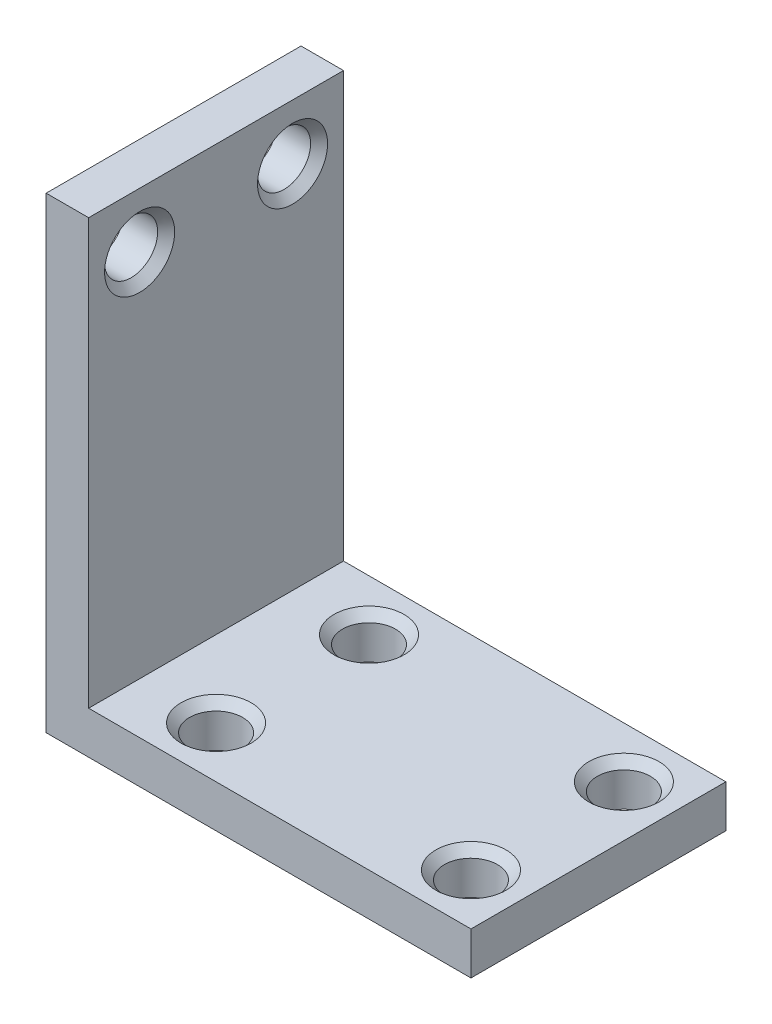
ISO-10303-21;
HEADER;
FILE_DESCRIPTION(('STEP AP214'),'2;1');
FILE_NAME('part.step','',(''),(''),'','','');
FILE_SCHEMA(('AUTOMOTIVE_DESIGN { 1 0 10303 214 1 1 1 1 }'));
ENDSEC;
DATA;
#1=APPLICATION_CONTEXT('core data for automotive mechanical design processes');
#2=APPLICATION_PROTOCOL_DEFINITION('international standard','automotive_design',2000,#1);
#3=PRODUCT_CONTEXT('',#1,'mechanical');
#4=PRODUCT('Part','Part','',(#3));
#5=PRODUCT_RELATED_PRODUCT_CATEGORY('part','',(#4));
#6=PRODUCT_DEFINITION_FORMATION('','',#4);
#7=PRODUCT_DEFINITION_CONTEXT('part definition',#1,'design');
#8=PRODUCT_DEFINITION('design','',#6,#7);
#9=PRODUCT_DEFINITION_SHAPE('','',#8);
#10=(LENGTH_UNIT() NAMED_UNIT(*) SI_UNIT(.MILLI.,.METRE.));
#11=(NAMED_UNIT(*) PLANE_ANGLE_UNIT() SI_UNIT($,.RADIAN.));
#12=(NAMED_UNIT(*) SI_UNIT($,.STERADIAN.) SOLID_ANGLE_UNIT());
#13=UNCERTAINTY_MEASURE_WITH_UNIT(LENGTH_MEASURE(1.E-05),#10,'distance_accuracy_value','');
#14=(GEOMETRIC_REPRESENTATION_CONTEXT(3) GLOBAL_UNCERTAINTY_ASSIGNED_CONTEXT((#13)) GLOBAL_UNIT_ASSIGNED_CONTEXT((#10,
#11,#12)) REPRESENTATION_CONTEXT('',''));
#15=CARTESIAN_POINT('',(0.,0.,0.));
#16=DIRECTION('',(0.,0.,1.));
#17=DIRECTION('',(1.,0.,0.));
#18=AXIS2_PLACEMENT_3D('',#15,#16,#17);
#19=CARTESIAN_POINT('',(-5.,1.,3.));
#20=DIRECTION('',(0.,0.,-1.));
#21=DIRECTION('',(-1.,0.,0.));
#22=AXIS2_PLACEMENT_3D('',#19,#20,#21);
#23=PLANE('',#22);
#24=DIRECTION('',(1.,0.,0.));
#25=VECTOR('',#24,1.);
#26=CARTESIAN_POINT('',(-5.,0.,3.));
#27=LINE('',#26,#25);
#28=CARTESIAN_POINT('',(-5.,0.,3.));
#29=VERTEX_POINT('',#28);
#30=CARTESIAN_POINT('',(5.,0.,3.));
#31=VERTEX_POINT('',#30);
#32=EDGE_CURVE('E87',#29,#31,#27,.T.);
#33=ORIENTED_EDGE('',*,*,#32,.T.);
#34=DIRECTION('',(0.,-1.,0.));
#35=VECTOR('',#34,1.);
#36=CARTESIAN_POINT('',(5.,1.,3.));
#37=LINE('',#36,#35);
#38=CARTESIAN_POINT('',(5.,1.,3.));
#39=VERTEX_POINT('',#38);
#40=EDGE_CURVE('E11',#39,#31,#37,.T.);
#41=ORIENTED_EDGE('',*,*,#40,.F.);
#42=DIRECTION('',(1.,0.,0.));
#43=VECTOR('',#42,1.);
#44=CARTESIAN_POINT('',(-5.,1.,3.));
#45=LINE('',#44,#43);
#46=CARTESIAN_POINT('',(-4.,1.,3.));
#47=VERTEX_POINT('',#46);
#48=EDGE_CURVE('E110',#47,#39,#45,.T.);
#49=ORIENTED_EDGE('',*,*,#48,.F.);
#50=DIRECTION('',(0.,-1.,0.));
#51=VECTOR('',#50,1.);
#52=CARTESIAN_POINT('',(-4.,11.,3.));
#53=LINE('',#52,#51);
#54=CARTESIAN_POINT('',(-4.,11.,3.));
#55=VERTEX_POINT('',#54);
#56=EDGE_CURVE('E105',#55,#47,#53,.T.);
#57=ORIENTED_EDGE('',*,*,#56,.F.);
#58=DIRECTION('',(1.,0.,0.));
#59=VECTOR('',#58,1.);
#60=CARTESIAN_POINT('',(-5.,11.,3.));
#61=LINE('',#60,#59);
#62=CARTESIAN_POINT('',(-5.,11.,3.));
#63=VERTEX_POINT('',#62);
#64=EDGE_CURVE('E91',#63,#55,#61,.T.);
#65=ORIENTED_EDGE('',*,*,#64,.F.);
#66=DIRECTION('',(0.,-1.,0.));
#67=VECTOR('',#66,1.);
#68=CARTESIAN_POINT('',(-5.,1.,3.));
#69=LINE('',#68,#67);
#70=EDGE_CURVE('E84',#63,#29,#69,.T.);
#71=ORIENTED_EDGE('',*,*,#70,.T.);
#72=EDGE_LOOP('',(#33,#41,#49,#57,#65,#71));
#73=FACE_BOUND('',#72,.T.);
#74=ADVANCED_FACE('F43',(#73),#23,.F.);
#75=CARTESIAN_POINT('',(5.,1.,3.));
#76=DIRECTION('',(-1.,0.,0.));
#77=DIRECTION('',(0.,0.,1.));
#78=AXIS2_PLACEMENT_3D('',#75,#76,#77);
#79=PLANE('',#78);
#80=DIRECTION('',(0.,0.,-1.));
#81=VECTOR('',#80,1.);
#82=CARTESIAN_POINT('',(5.,0.,3.));
#83=LINE('',#82,#81);
#84=CARTESIAN_POINT('',(5.,0.,-3.));
#85=VERTEX_POINT('',#84);
#86=EDGE_CURVE('E104',#31,#85,#83,.T.);
#87=ORIENTED_EDGE('',*,*,#86,.T.);
#88=DIRECTION('',(0.,-1.,0.));
#89=VECTOR('',#88,1.);
#90=CARTESIAN_POINT('',(5.,1.,-3.));
#91=LINE('',#90,#89);
#92=CARTESIAN_POINT('',(5.,1.,-3.));
#93=VERTEX_POINT('',#92);
#94=EDGE_CURVE('E50',#93,#85,#91,.T.);
#95=ORIENTED_EDGE('',*,*,#94,.F.);
#96=DIRECTION('',(0.,0.,-1.));
#97=VECTOR('',#96,1.);
#98=CARTESIAN_POINT('',(5.,1.,3.));
#99=LINE('',#98,#97);
#100=EDGE_CURVE('E113',#39,#93,#99,.T.);
#101=ORIENTED_EDGE('',*,*,#100,.F.);
#102=ORIENTED_EDGE('',*,*,#40,.T.);
#103=EDGE_LOOP('',(#87,#95,#101,#102));
#104=FACE_BOUND('',#103,.T.);
#105=ADVANCED_FACE('F122',(#104),#79,.F.);
#106=CARTESIAN_POINT('',(-5.,1.,-3.));
#107=DIRECTION('',(0.,0.,-1.));
#108=DIRECTION('',(-1.,0.,0.));
#109=AXIS2_PLACEMENT_3D('',#106,#107,#108);
#110=PLANE('',#109);
#111=DIRECTION('',(1.,0.,0.));
#112=VECTOR('',#111,1.);
#113=CARTESIAN_POINT('',(-5.,0.,-3.));
#114=LINE('',#113,#112);
#115=CARTESIAN_POINT('',(-5.,0.,-3.));
#116=VERTEX_POINT('',#115);
#117=EDGE_CURVE('E111',#116,#85,#114,.T.);
#118=ORIENTED_EDGE('',*,*,#117,.F.);
#119=DIRECTION('',(0.,-1.,0.));
#120=VECTOR('',#119,1.);
#121=CARTESIAN_POINT('',(-5.,1.,-3.));
#122=LINE('',#121,#120);
#123=CARTESIAN_POINT('',(-5.,11.,-3.));
#124=VERTEX_POINT('',#123);
#125=EDGE_CURVE('E96',#124,#116,#122,.T.);
#126=ORIENTED_EDGE('',*,*,#125,.F.);
#127=DIRECTION('',(-1.,0.,0.));
#128=VECTOR('',#127,1.);
#129=CARTESIAN_POINT('',(-5.,11.,-3.));
#130=LINE('',#129,#128);
#131=CARTESIAN_POINT('',(-4.,11.,-3.));
#132=VERTEX_POINT('',#131);
#133=EDGE_CURVE('E130',#132,#124,#130,.T.);
#134=ORIENTED_EDGE('',*,*,#133,.F.);
#135=DIRECTION('',(0.,-1.,0.));
#136=VECTOR('',#135,1.);
#137=CARTESIAN_POINT('',(-4.,11.,-3.));
#138=LINE('',#137,#136);
#139=CARTESIAN_POINT('',(-4.,1.,-3.));
#140=VERTEX_POINT('',#139);
#141=EDGE_CURVE('E128',#132,#140,#138,.T.);
#142=ORIENTED_EDGE('',*,*,#141,.T.);
#143=DIRECTION('',(1.,0.,0.));
#144=VECTOR('',#143,1.);
#145=CARTESIAN_POINT('',(-5.,1.,-3.));
#146=LINE('',#145,#144);
#147=EDGE_CURVE('E65',#140,#93,#146,.T.);
#148=ORIENTED_EDGE('',*,*,#147,.T.);
#149=ORIENTED_EDGE('',*,*,#94,.T.);
#150=EDGE_LOOP('',(#118,#126,#134,#142,#148,#149));
#151=FACE_BOUND('',#150,.T.);
#152=ADVANCED_FACE('F119',(#151),#110,.T.);
#153=CARTESIAN_POINT('',(-5.,1.,3.));
#154=DIRECTION('',(-1.,0.,0.));
#155=DIRECTION('',(0.,0.,1.));
#156=AXIS2_PLACEMENT_3D('',#153,#154,#155);
#157=PLANE('',#156);
#158=CARTESIAN_POINT('',(-5.,9.7,-1.8));
#159=DIRECTION('',(1.,0.,0.));
#160=DIRECTION('',(0.,0.,-1.));
#161=AXIS2_PLACEMENT_3D('',#158,#159,#160);
#162=CIRCLE('',#161,0.624999999999999);
#163=CARTESIAN_POINT('',(-5.,9.7,-2.425));
#164=VERTEX_POINT('',#163);
#165=EDGE_CURVE('E149',#164,#164,#162,.T.);
#166=ORIENTED_EDGE('',*,*,#165,.T.);
#167=EDGE_LOOP('',(#166));
#168=FACE_BOUND('',#167,.T.);
#169=CARTESIAN_POINT('',(-5.,9.7,1.8));
#170=DIRECTION('',(1.,0.,0.));
#171=DIRECTION('',(0.,0.,-1.));
#172=AXIS2_PLACEMENT_3D('',#169,#170,#171);
#173=CIRCLE('',#172,0.624999999999999);
#174=CARTESIAN_POINT('',(-5.,9.7,1.175));
#175=VERTEX_POINT('',#174);
#176=EDGE_CURVE('E133',#175,#175,#173,.T.);
#177=ORIENTED_EDGE('',*,*,#176,.T.);
#178=EDGE_LOOP('',(#177));
#179=FACE_BOUND('',#178,.T.);
#180=DIRECTION('',(0.,0.,-1.));
#181=VECTOR('',#180,1.);
#182=CARTESIAN_POINT('',(-5.,0.,3.));
#183=LINE('',#182,#181);
#184=EDGE_CURVE('E102',#29,#116,#183,.T.);
#185=ORIENTED_EDGE('',*,*,#184,.F.);
#186=ORIENTED_EDGE('',*,*,#70,.F.);
#187=DIRECTION('',(0.,0.,1.));
#188=VECTOR('',#187,1.);
#189=CARTESIAN_POINT('',(-5.,11.,-3.));
#190=LINE('',#189,#188);
#191=EDGE_CURVE('E132',#124,#63,#190,.T.);
#192=ORIENTED_EDGE('',*,*,#191,.F.);
#193=ORIENTED_EDGE('',*,*,#125,.T.);
#194=EDGE_LOOP('',(#185,#186,#192,#193));
#195=FACE_BOUND('',#194,.T.);
#196=ADVANCED_FACE('F107',(#168,#179,#195),#157,.T.);
#197=CARTESIAN_POINT('',(0.,1.,0.));
#198=DIRECTION('',(0.,1.,0.));
#199=DIRECTION('',(0.,0.,1.));
#200=AXIS2_PLACEMENT_3D('',#197,#198,#199);
#201=PLANE('',#200);
#202=CARTESIAN_POINT('',(-2.2,1.,1.8));
#203=DIRECTION('',(0.,1.,0.));
#204=DIRECTION('',(0.,0.,1.));
#205=AXIS2_PLACEMENT_3D('',#202,#203,#204);
#206=CIRCLE('',#205,0.824999999999999);
#207=CARTESIAN_POINT('',(-2.2,1.,2.625));
#208=VERTEX_POINT('',#207);
#209=EDGE_CURVE('E191',#208,#208,#206,.T.);
#210=ORIENTED_EDGE('',*,*,#209,.F.);
#211=EDGE_LOOP('',(#210));
#212=FACE_BOUND('',#211,.T.);
#213=CARTESIAN_POINT('',(-2.2,1.,-1.8));
#214=DIRECTION('',(0.,1.,0.));
#215=DIRECTION('',(0.,0.,1.));
#216=AXIS2_PLACEMENT_3D('',#213,#214,#215);
#217=CIRCLE('',#216,0.824999999999999);
#218=CARTESIAN_POINT('',(-2.2,1.,-0.975));
#219=VERTEX_POINT('',#218);
#220=EDGE_CURVE('E182',#219,#219,#217,.T.);
#221=ORIENTED_EDGE('',*,*,#220,.F.);
#222=EDGE_LOOP('',(#221));
#223=FACE_BOUND('',#222,.T.);
#224=CARTESIAN_POINT('',(3.8,1.,-1.8));
#225=DIRECTION('',(0.,1.,0.));
#226=DIRECTION('',(0.,0.,1.));
#227=AXIS2_PLACEMENT_3D('',#224,#225,#226);
#228=CIRCLE('',#227,0.824999999999999);
#229=CARTESIAN_POINT('',(3.8,1.,-0.975000000000001));
#230=VERTEX_POINT('',#229);
#231=EDGE_CURVE('E173',#230,#230,#228,.T.);
#232=ORIENTED_EDGE('',*,*,#231,.F.);
#233=EDGE_LOOP('',(#232));
#234=FACE_BOUND('',#233,.T.);
#235=CARTESIAN_POINT('',(3.8,1.,1.8));
#236=DIRECTION('',(0.,1.,0.));
#237=DIRECTION('',(0.,0.,1.));
#238=AXIS2_PLACEMENT_3D('',#235,#236,#237);
#239=CIRCLE('',#238,0.824999999999999);
#240=CARTESIAN_POINT('',(3.8,1.,2.625));
#241=VERTEX_POINT('',#240);
#242=EDGE_CURVE('E164',#241,#241,#239,.T.);
#243=ORIENTED_EDGE('',*,*,#242,.F.);
#244=EDGE_LOOP('',(#243));
#245=FACE_BOUND('',#244,.T.);
#246=DIRECTION('',(0.,0.,-1.));
#247=VECTOR('',#246,1.);
#248=CARTESIAN_POINT('',(-4.,1.,-3.));
#249=LINE('',#248,#247);
#250=EDGE_CURVE('E57',#47,#140,#249,.T.);
#251=ORIENTED_EDGE('',*,*,#250,.F.);
#252=ORIENTED_EDGE('',*,*,#48,.T.);
#253=ORIENTED_EDGE('',*,*,#100,.T.);
#254=ORIENTED_EDGE('',*,*,#147,.F.);
#255=EDGE_LOOP('',(#251,#252,#253,#254));
#256=FACE_BOUND('',#255,.T.);
#257=ADVANCED_FACE('F197',(#212,#223,#234,#245,#256),#201,.T.);
#258=CARTESIAN_POINT('',(0.,0.,0.));
#259=DIRECTION('',(0.,1.,0.));
#260=DIRECTION('',(0.,0.,1.));
#261=AXIS2_PLACEMENT_3D('',#258,#259,#260);
#262=PLANE('',#261);
#263=CARTESIAN_POINT('',(-2.2,0.,1.8));
#264=DIRECTION('',(0.,1.,0.));
#265=DIRECTION('',(0.,0.,1.));
#266=AXIS2_PLACEMENT_3D('',#263,#264,#265);
#267=CIRCLE('',#266,0.624999999999999);
#268=CARTESIAN_POINT('',(-2.2,0.,2.425));
#269=VERTEX_POINT('',#268);
#270=EDGE_CURVE('E185',#269,#269,#267,.T.);
#271=ORIENTED_EDGE('',*,*,#270,.T.);
#272=EDGE_LOOP('',(#271));
#273=FACE_BOUND('',#272,.T.);
#274=CARTESIAN_POINT('',(-2.2,0.,-1.8));
#275=DIRECTION('',(0.,1.,0.));
#276=DIRECTION('',(0.,0.,1.));
#277=AXIS2_PLACEMENT_3D('',#274,#275,#276);
#278=CIRCLE('',#277,0.624999999999999);
#279=CARTESIAN_POINT('',(-2.2,0.,-1.175));
#280=VERTEX_POINT('',#279);
#281=EDGE_CURVE('E176',#280,#280,#278,.T.);
#282=ORIENTED_EDGE('',*,*,#281,.T.);
#283=EDGE_LOOP('',(#282));
#284=FACE_BOUND('',#283,.T.);
#285=CARTESIAN_POINT('',(3.8,0.,-1.8));
#286=DIRECTION('',(0.,1.,0.));
#287=DIRECTION('',(0.,0.,1.));
#288=AXIS2_PLACEMENT_3D('',#285,#286,#287);
#289=CIRCLE('',#288,0.624999999999998);
#290=CARTESIAN_POINT('',(3.8,0.,-1.175));
#291=VERTEX_POINT('',#290);
#292=EDGE_CURVE('E167',#291,#291,#289,.T.);
#293=ORIENTED_EDGE('',*,*,#292,.T.);
#294=EDGE_LOOP('',(#293));
#295=FACE_BOUND('',#294,.T.);
#296=CARTESIAN_POINT('',(3.8,0.,1.8));
#297=DIRECTION('',(0.,1.,0.));
#298=DIRECTION('',(0.,0.,1.));
#299=AXIS2_PLACEMENT_3D('',#296,#297,#298);
#300=CIRCLE('',#299,0.624999999999998);
#301=CARTESIAN_POINT('',(3.8,0.,2.425));
#302=VERTEX_POINT('',#301);
#303=EDGE_CURVE('E158',#302,#302,#300,.T.);
#304=ORIENTED_EDGE('',*,*,#303,.T.);
#305=EDGE_LOOP('',(#304));
#306=FACE_BOUND('',#305,.T.);
#307=ORIENTED_EDGE('',*,*,#32,.F.);
#308=ORIENTED_EDGE('',*,*,#184,.T.);
#309=ORIENTED_EDGE('',*,*,#117,.T.);
#310=ORIENTED_EDGE('',*,*,#86,.F.);
#311=EDGE_LOOP('',(#307,#308,#309,#310));
#312=FACE_BOUND('',#311,.T.);
#313=ADVANCED_FACE('F100',(#273,#284,#295,#306,#312),#262,.F.);
#314=CARTESIAN_POINT('',(-4.,11.,-3.));
#315=DIRECTION('',(-1.,0.,0.));
#316=DIRECTION('',(0.,0.,1.));
#317=AXIS2_PLACEMENT_3D('',#314,#315,#316);
#318=PLANE('',#317);
#319=CARTESIAN_POINT('',(-4.,9.7,-1.8));
#320=DIRECTION('',(1.,0.,0.));
#321=DIRECTION('',(0.,0.,-1.));
#322=AXIS2_PLACEMENT_3D('',#319,#320,#321);
#323=CIRCLE('',#322,0.824999999999999);
#324=CARTESIAN_POINT('',(-4.,9.7,-2.625));
#325=VERTEX_POINT('',#324);
#326=EDGE_CURVE('E155',#325,#325,#323,.T.);
#327=ORIENTED_EDGE('',*,*,#326,.F.);
#328=EDGE_LOOP('',(#327));
#329=FACE_BOUND('',#328,.T.);
#330=CARTESIAN_POINT('',(-4.,9.7,1.8));
#331=DIRECTION('',(1.,0.,0.));
#332=DIRECTION('',(0.,0.,-1.));
#333=AXIS2_PLACEMENT_3D('',#330,#331,#332);
#334=CIRCLE('',#333,0.824999999999999);
#335=CARTESIAN_POINT('',(-4.,9.7,0.975000000000002));
#336=VERTEX_POINT('',#335);
#337=EDGE_CURVE('E146',#336,#336,#334,.T.);
#338=ORIENTED_EDGE('',*,*,#337,.F.);
#339=EDGE_LOOP('',(#338));
#340=FACE_BOUND('',#339,.T.);
#341=ORIENTED_EDGE('',*,*,#250,.T.);
#342=ORIENTED_EDGE('',*,*,#141,.F.);
#343=DIRECTION('',(0.,0.,-1.));
#344=VECTOR('',#343,1.);
#345=CARTESIAN_POINT('',(-4.,11.,-3.));
#346=LINE('',#345,#344);
#347=EDGE_CURVE('E136',#55,#132,#346,.T.);
#348=ORIENTED_EDGE('',*,*,#347,.F.);
#349=ORIENTED_EDGE('',*,*,#56,.T.);
#350=EDGE_LOOP('',(#341,#342,#348,#349));
#351=FACE_BOUND('',#350,.T.);
#352=ADVANCED_FACE('F239',(#329,#340,#351),#318,.F.);
#353=CARTESIAN_POINT('',(0.,11.,0.));
#354=DIRECTION('',(0.,1.,0.));
#355=DIRECTION('',(0.,0.,1.));
#356=AXIS2_PLACEMENT_3D('',#353,#354,#355);
#357=PLANE('',#356);
#358=ORIENTED_EDGE('',*,*,#191,.T.);
#359=ORIENTED_EDGE('',*,*,#64,.T.);
#360=ORIENTED_EDGE('',*,*,#347,.T.);
#361=ORIENTED_EDGE('',*,*,#133,.T.);
#362=EDGE_LOOP('',(#358,#359,#360,#361));
#363=FACE_BOUND('',#362,.T.);
#364=ADVANCED_FACE('F244',(#363),#357,.T.);
#365=CARTESIAN_POINT('',(-4.,9.7,1.8));
#366=DIRECTION('',(1.,0.,0.));
#367=DIRECTION('',(0.,0.,-1.));
#368=AXIS2_PLACEMENT_3D('',#365,#366,#367);
#369=CYLINDRICAL_SURFACE('',#368,0.624999999999994);
#370=ORIENTED_EDGE('',*,*,#176,.F.);
#371=EDGE_LOOP('',(#370));
#372=FACE_BOUND('',#371,.T.);
#373=CARTESIAN_POINT('',(-4.2,9.7,1.8));
#374=DIRECTION('',(1.,0.,0.));
#375=DIRECTION('',(0.,0.,-1.));
#376=AXIS2_PLACEMENT_3D('',#373,#374,#375);
#377=CIRCLE('',#376,0.624999999999988);
#378=CARTESIAN_POINT('',(-4.2,9.7,1.17500000000001));
#379=VERTEX_POINT('',#378);
#380=EDGE_CURVE('E143',#379,#379,#377,.T.);
#381=ORIENTED_EDGE('',*,*,#380,.T.);
#382=EDGE_LOOP('',(#381));
#383=FACE_BOUND('',#382,.T.);
#384=ADVANCED_FACE('F248',(#372,#383),#369,.F.);
#385=CARTESIAN_POINT('',(-4.,9.7,1.8));
#386=DIRECTION('',(1.,0.,0.));
#387=DIRECTION('',(0.,0.,-1.));
#388=AXIS2_PLACEMENT_3D('',#385,#386,#387);
#389=CONICAL_SURFACE('',#388,0.824999999999999,0.785398163397457);
#390=ORIENTED_EDGE('',*,*,#380,.F.);
#391=EDGE_LOOP('',(#390));
#392=FACE_BOUND('',#391,.T.);
#393=ORIENTED_EDGE('',*,*,#337,.T.);
#394=EDGE_LOOP('',(#393));
#395=FACE_BOUND('',#394,.T.);
#396=ADVANCED_FACE('F252',(#392,#395),#389,.F.);
#397=CARTESIAN_POINT('',(-4.,9.7,-1.8));
#398=DIRECTION('',(1.,0.,0.));
#399=DIRECTION('',(0.,0.,-1.));
#400=AXIS2_PLACEMENT_3D('',#397,#398,#399);
#401=CYLINDRICAL_SURFACE('',#400,0.624999999999994);
#402=ORIENTED_EDGE('',*,*,#165,.F.);
#403=EDGE_LOOP('',(#402));
#404=FACE_BOUND('',#403,.T.);
#405=CARTESIAN_POINT('',(-4.20000000000001,9.7,-1.8));
#406=DIRECTION('',(1.,0.,0.));
#407=DIRECTION('',(0.,0.,-1.));
#408=AXIS2_PLACEMENT_3D('',#405,#406,#407);
#409=CIRCLE('',#408,0.624999999999988);
#410=CARTESIAN_POINT('',(-4.20000000000001,9.7,-2.42499999999999));
#411=VERTEX_POINT('',#410);
#412=EDGE_CURVE('E152',#411,#411,#409,.T.);
#413=ORIENTED_EDGE('',*,*,#412,.T.);
#414=EDGE_LOOP('',(#413));
#415=FACE_BOUND('',#414,.T.);
#416=ADVANCED_FACE('F256',(#404,#415),#401,.F.);
#417=CARTESIAN_POINT('',(-4.,9.7,-1.8));
#418=DIRECTION('',(1.,0.,0.));
#419=DIRECTION('',(0.,0.,-1.));
#420=AXIS2_PLACEMENT_3D('',#417,#418,#419);
#421=CONICAL_SURFACE('',#420,0.824999999999999,0.785398163397457);
#422=ORIENTED_EDGE('',*,*,#412,.F.);
#423=EDGE_LOOP('',(#422));
#424=FACE_BOUND('',#423,.T.);
#425=ORIENTED_EDGE('',*,*,#326,.T.);
#426=EDGE_LOOP('',(#425));
#427=FACE_BOUND('',#426,.T.);
#428=ADVANCED_FACE('F222',(#424,#427),#421,.F.);
#429=CARTESIAN_POINT('',(3.8,1.,1.8));
#430=DIRECTION('',(0.,1.,0.));
#431=DIRECTION('',(0.,0.,1.));
#432=AXIS2_PLACEMENT_3D('',#429,#430,#431);
#433=CYLINDRICAL_SURFACE('',#432,0.624999999999993);
#434=ORIENTED_EDGE('',*,*,#303,.F.);
#435=EDGE_LOOP('',(#434));
#436=FACE_BOUND('',#435,.T.);
#437=CARTESIAN_POINT('',(3.8,0.799999999999994,1.8));
#438=DIRECTION('',(0.,1.,0.));
#439=DIRECTION('',(0.,0.,1.));
#440=AXIS2_PLACEMENT_3D('',#437,#438,#439);
#441=CIRCLE('',#440,0.624999999999988);
#442=CARTESIAN_POINT('',(3.8,0.799999999999994,2.42499999999999));
#443=VERTEX_POINT('',#442);
#444=EDGE_CURVE('E161',#443,#443,#441,.T.);
#445=ORIENTED_EDGE('',*,*,#444,.T.);
#446=EDGE_LOOP('',(#445));
#447=FACE_BOUND('',#446,.T.);
#448=ADVANCED_FACE('F210',(#436,#447),#433,.F.);
#449=CARTESIAN_POINT('',(3.8,1.,1.8));
#450=DIRECTION('',(0.,1.,0.));
#451=DIRECTION('',(0.,0.,1.));
#452=AXIS2_PLACEMENT_3D('',#449,#450,#451);
#453=CONICAL_SURFACE('',#452,0.824999999999999,0.785398163397457);
#454=ORIENTED_EDGE('',*,*,#444,.F.);
#455=EDGE_LOOP('',(#454));
#456=FACE_BOUND('',#455,.T.);
#457=ORIENTED_EDGE('',*,*,#242,.T.);
#458=EDGE_LOOP('',(#457));
#459=FACE_BOUND('',#458,.T.);
#460=ADVANCED_FACE('F207',(#456,#459),#453,.F.);
#461=CARTESIAN_POINT('',(3.8,1.,-1.8));
#462=DIRECTION('',(0.,1.,0.));
#463=DIRECTION('',(0.,0.,1.));
#464=AXIS2_PLACEMENT_3D('',#461,#462,#463);
#465=CYLINDRICAL_SURFACE('',#464,0.624999999999993);
#466=ORIENTED_EDGE('',*,*,#292,.F.);
#467=EDGE_LOOP('',(#466));
#468=FACE_BOUND('',#467,.T.);
#469=CARTESIAN_POINT('',(3.8,0.799999999999994,-1.8));
#470=DIRECTION('',(0.,1.,0.));
#471=DIRECTION('',(0.,0.,1.));
#472=AXIS2_PLACEMENT_3D('',#469,#470,#471);
#473=CIRCLE('',#472,0.624999999999988);
#474=CARTESIAN_POINT('',(3.8,0.799999999999994,-1.17500000000001));
#475=VERTEX_POINT('',#474);
#476=EDGE_CURVE('E170',#475,#475,#473,.T.);
#477=ORIENTED_EDGE('',*,*,#476,.T.);
#478=EDGE_LOOP('',(#477));
#479=FACE_BOUND('',#478,.T.);
#480=ADVANCED_FACE('F209',(#468,#479),#465,.F.);
#481=CARTESIAN_POINT('',(3.8,1.,-1.8));
#482=DIRECTION('',(0.,1.,0.));
#483=DIRECTION('',(0.,0.,1.));
#484=AXIS2_PLACEMENT_3D('',#481,#482,#483);
#485=CONICAL_SURFACE('',#484,0.824999999999999,0.785398163397457);
#486=ORIENTED_EDGE('',*,*,#476,.F.);
#487=EDGE_LOOP('',(#486));
#488=FACE_BOUND('',#487,.T.);
#489=ORIENTED_EDGE('',*,*,#231,.T.);
#490=EDGE_LOOP('',(#489));
#491=FACE_BOUND('',#490,.T.);
#492=ADVANCED_FACE('F218',(#488,#491),#485,.F.);
#493=CARTESIAN_POINT('',(-2.2,1.,-1.8));
#494=DIRECTION('',(0.,1.,0.));
#495=DIRECTION('',(0.,0.,1.));
#496=AXIS2_PLACEMENT_3D('',#493,#494,#495);
#497=CYLINDRICAL_SURFACE('',#496,0.624999999999994);
#498=ORIENTED_EDGE('',*,*,#281,.F.);
#499=EDGE_LOOP('',(#498));
#500=FACE_BOUND('',#499,.T.);
#501=CARTESIAN_POINT('',(-2.2,0.799999999999994,-1.8));
#502=DIRECTION('',(0.,1.,0.));
#503=DIRECTION('',(0.,0.,1.));
#504=AXIS2_PLACEMENT_3D('',#501,#502,#503);
#505=CIRCLE('',#504,0.624999999999988);
#506=CARTESIAN_POINT('',(-2.2,0.799999999999994,-1.17500000000001));
#507=VERTEX_POINT('',#506);
#508=EDGE_CURVE('E179',#507,#507,#505,.T.);
#509=ORIENTED_EDGE('',*,*,#508,.T.);
#510=EDGE_LOOP('',(#509));
#511=FACE_BOUND('',#510,.T.);
#512=ADVANCED_FACE('F308',(#500,#511),#497,.F.);
#513=CARTESIAN_POINT('',(-2.2,1.,-1.8));
#514=DIRECTION('',(0.,1.,0.));
#515=DIRECTION('',(0.,0.,1.));
#516=AXIS2_PLACEMENT_3D('',#513,#514,#515);
#517=CONICAL_SURFACE('',#516,0.824999999999999,0.785398163397457);
#518=ORIENTED_EDGE('',*,*,#508,.F.);
#519=EDGE_LOOP('',(#518));
#520=FACE_BOUND('',#519,.T.);
#521=ORIENTED_EDGE('',*,*,#220,.T.);
#522=EDGE_LOOP('',(#521));
#523=FACE_BOUND('',#522,.T.);
#524=ADVANCED_FACE('F301',(#520,#523),#517,.F.);
#525=CARTESIAN_POINT('',(-2.2,1.,1.8));
#526=DIRECTION('',(0.,1.,0.));
#527=DIRECTION('',(0.,0.,1.));
#528=AXIS2_PLACEMENT_3D('',#525,#526,#527);
#529=CYLINDRICAL_SURFACE('',#528,0.624999999999994);
#530=ORIENTED_EDGE('',*,*,#270,.F.);
#531=EDGE_LOOP('',(#530));
#532=FACE_BOUND('',#531,.T.);
#533=CARTESIAN_POINT('',(-2.2,0.799999999999994,1.8));
#534=DIRECTION('',(0.,1.,0.));
#535=DIRECTION('',(0.,0.,1.));
#536=AXIS2_PLACEMENT_3D('',#533,#534,#535);
#537=CIRCLE('',#536,0.624999999999988);
#538=CARTESIAN_POINT('',(-2.2,0.799999999999994,2.42499999999999));
#539=VERTEX_POINT('',#538);
#540=EDGE_CURVE('E188',#539,#539,#537,.T.);
#541=ORIENTED_EDGE('',*,*,#540,.T.);
#542=EDGE_LOOP('',(#541));
#543=FACE_BOUND('',#542,.T.);
#544=ADVANCED_FACE('F297',(#532,#543),#529,.F.);
#545=CARTESIAN_POINT('',(-2.2,1.,1.8));
#546=DIRECTION('',(0.,1.,0.));
#547=DIRECTION('',(0.,0.,1.));
#548=AXIS2_PLACEMENT_3D('',#545,#546,#547);
#549=CONICAL_SURFACE('',#548,0.824999999999999,0.785398163397457);
#550=ORIENTED_EDGE('',*,*,#540,.F.);
#551=EDGE_LOOP('',(#550));
#552=FACE_BOUND('',#551,.T.);
#553=ORIENTED_EDGE('',*,*,#209,.T.);
#554=EDGE_LOOP('',(#553));
#555=FACE_BOUND('',#554,.T.);
#556=ADVANCED_FACE('F195',(#552,#555),#549,.F.);
#557=CLOSED_SHELL('',(#74,#105,#152,#196,#257,#313,#352,#364,#384,#396,#416,#428,#448,#460,#480,
#492,#512,#524,#544,#556));
#558=MANIFOLD_SOLID_BREP('B2',#557);
#559=ADVANCED_BREP_SHAPE_REPRESENTATION('',(#18,#558),#14);
#560=SHAPE_DEFINITION_REPRESENTATION(#9,#559);
ENDSEC;
END-ISO-10303-21;
